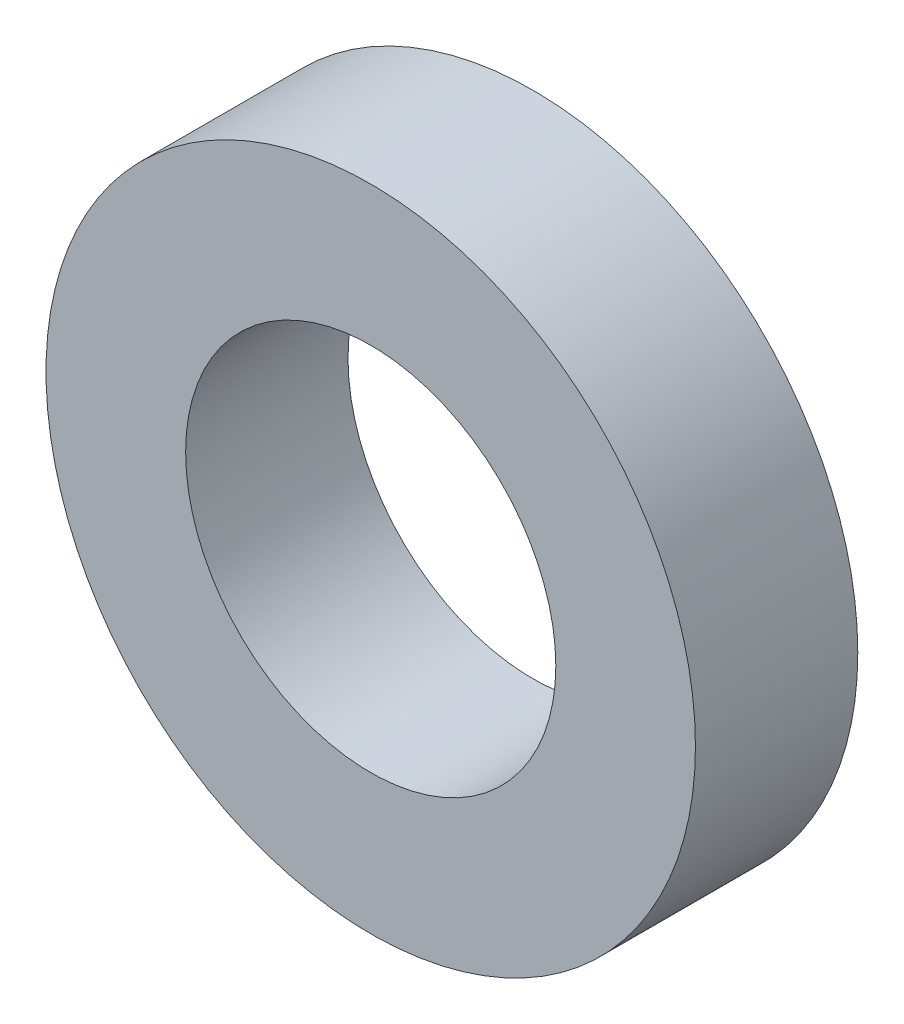
ISO-10303-21;
HEADER;
FILE_DESCRIPTION(('STEP AP214'),'2;1');
FILE_NAME('part.step','',(''),(''),'','','');
FILE_SCHEMA(('AUTOMOTIVE_DESIGN { 1 0 10303 214 1 1 1 1 }'));
ENDSEC;
DATA;
#1=APPLICATION_CONTEXT('core data for automotive mechanical design processes');
#2=APPLICATION_PROTOCOL_DEFINITION('international standard','automotive_design',2000,#1);
#3=PRODUCT_CONTEXT('',#1,'mechanical');
#4=PRODUCT('Part','Part','',(#3));
#5=PRODUCT_RELATED_PRODUCT_CATEGORY('part','',(#4));
#6=PRODUCT_DEFINITION_FORMATION('','',#4);
#7=PRODUCT_DEFINITION_CONTEXT('part definition',#1,'design');
#8=PRODUCT_DEFINITION('design','',#6,#7);
#9=PRODUCT_DEFINITION_SHAPE('','',#8);
#10=(LENGTH_UNIT() NAMED_UNIT(*) SI_UNIT(.MILLI.,.METRE.));
#11=(NAMED_UNIT(*) PLANE_ANGLE_UNIT() SI_UNIT($,.RADIAN.));
#12=(NAMED_UNIT(*) SI_UNIT($,.STERADIAN.) SOLID_ANGLE_UNIT());
#13=UNCERTAINTY_MEASURE_WITH_UNIT(LENGTH_MEASURE(1.E-05),#10,'distance_accuracy_value','');
#14=(GEOMETRIC_REPRESENTATION_CONTEXT(3) GLOBAL_UNCERTAINTY_ASSIGNED_CONTEXT((#13)) GLOBAL_UNIT_ASSIGNED_CONTEXT((#10,
#11,#12)) REPRESENTATION_CONTEXT('',''));
#15=CARTESIAN_POINT('',(0.,0.,0.));
#16=DIRECTION('',(0.,0.,1.));
#17=DIRECTION('',(1.,0.,0.));
#18=AXIS2_PLACEMENT_3D('',#15,#16,#17);
#19=CARTESIAN_POINT('',(0.,0.,14.5));
#20=DIRECTION('',(0.,0.,1.));
#21=DIRECTION('',(1.,0.,0.));
#22=AXIS2_PLACEMENT_3D('',#19,#20,#21);
#23=PLANE('',#22);
#24=CARTESIAN_POINT('',(0.,0.,14.5));
#25=DIRECTION('',(0.,0.,1.));
#26=DIRECTION('',(-1.,0.,0.));
#27=AXIS2_PLACEMENT_3D('',#24,#25,#26);
#28=CIRCLE('',#27,2.85);
#29=CARTESIAN_POINT('',(2.85,0.,14.5));
#30=VERTEX_POINT('',#29);
#31=EDGE_CURVE('E60',#30,#30,#28,.T.);
#32=ORIENTED_EDGE('',*,*,#31,.T.);
#33=EDGE_LOOP('',(#32));
#34=FACE_BOUND('',#33,.T.);
#35=CARTESIAN_POINT('',(0.,0.,14.5));
#36=DIRECTION('',(0.,0.,-1.));
#37=DIRECTION('',(-1.,0.,0.));
#38=AXIS2_PLACEMENT_3D('',#35,#36,#37);
#39=CIRCLE('',#38,5.);
#40=CARTESIAN_POINT('',(5.,0.,14.5));
#41=VERTEX_POINT('',#40);
#42=EDGE_CURVE('E75',#41,#41,#39,.T.);
#43=ORIENTED_EDGE('',*,*,#42,.T.);
#44=EDGE_LOOP('',(#43));
#45=FACE_BOUND('',#44,.T.);
#46=ADVANCED_FACE('F17',(#34,#45),#23,.F.);
#47=CARTESIAN_POINT('',(0.,0.,17.));
#48=DIRECTION('',(0.,0.,1.));
#49=DIRECTION('',(1.,0.,0.));
#50=AXIS2_PLACEMENT_3D('',#47,#48,#49);
#51=PLANE('',#50);
#52=CARTESIAN_POINT('',(0.,0.,17.));
#53=DIRECTION('',(0.,0.,-1.));
#54=DIRECTION('',(-1.,0.,0.));
#55=AXIS2_PLACEMENT_3D('',#52,#53,#54);
#56=CIRCLE('',#55,2.85);
#57=CARTESIAN_POINT('',(2.85,0.,17.));
#58=VERTEX_POINT('',#57);
#59=EDGE_CURVE('E59',#58,#58,#56,.T.);
#60=ORIENTED_EDGE('',*,*,#59,.T.);
#61=EDGE_LOOP('',(#60));
#62=FACE_BOUND('',#61,.T.);
#63=CARTESIAN_POINT('',(0.,0.,17.));
#64=DIRECTION('',(0.,0.,1.));
#65=DIRECTION('',(-1.,0.,0.));
#66=AXIS2_PLACEMENT_3D('',#63,#64,#65);
#67=CIRCLE('',#66,5.);
#68=CARTESIAN_POINT('',(5.,0.,17.));
#69=VERTEX_POINT('',#68);
#70=EDGE_CURVE('E11',#69,#69,#67,.T.);
#71=ORIENTED_EDGE('',*,*,#70,.T.);
#72=EDGE_LOOP('',(#71));
#73=FACE_BOUND('',#72,.T.);
#74=ADVANCED_FACE('F79',(#62,#73),#51,.T.);
#75=CARTESIAN_POINT('',(0.,0.,17.));
#76=DIRECTION('',(0.,0.,-1.));
#77=DIRECTION('',(-1.,0.,0.));
#78=AXIS2_PLACEMENT_3D('',#75,#76,#77);
#79=CYLINDRICAL_SURFACE('',#78,5.);
#80=ORIENTED_EDGE('',*,*,#42,.F.);
#81=DIRECTION('',(0.,0.,1.));
#82=VECTOR('',#81,1.);
#83=CARTESIAN_POINT('',(5.,0.,17.));
#84=LINE('',#83,#82);
#85=EDGE_CURVE('E20',#41,#69,#84,.T.);
#86=ORIENTED_EDGE('',*,*,#85,.T.);
#87=ORIENTED_EDGE('',*,*,#70,.F.);
#88=ORIENTED_EDGE('',*,*,#85,.F.);
#89=EDGE_LOOP('',(#80,#86,#87,#88));
#90=FACE_BOUND('',#89,.T.);
#91=ADVANCED_FACE('F77',(#90),#79,.T.);
#92=CARTESIAN_POINT('',(0.,0.,17.));
#93=DIRECTION('',(0.,0.,-1.));
#94=DIRECTION('',(-1.,0.,0.));
#95=AXIS2_PLACEMENT_3D('',#92,#93,#94);
#96=CYLINDRICAL_SURFACE('',#95,2.85);
#97=ORIENTED_EDGE('',*,*,#31,.F.);
#98=DIRECTION('',(0.,0.,1.));
#99=VECTOR('',#98,1.);
#100=CARTESIAN_POINT('',(2.85,0.,17.));
#101=LINE('',#100,#99);
#102=EDGE_CURVE('E53',#30,#58,#101,.T.);
#103=ORIENTED_EDGE('',*,*,#102,.T.);
#104=ORIENTED_EDGE('',*,*,#59,.F.);
#105=ORIENTED_EDGE('',*,*,#102,.F.);
#106=EDGE_LOOP('',(#97,#103,#104,#105));
#107=FACE_BOUND('',#106,.T.);
#108=ADVANCED_FACE('F57',(#107),#96,.F.);
#109=CLOSED_SHELL('',(#46,#74,#91,#108));
#110=MANIFOLD_SOLID_BREP('B1',#109);
#111=ADVANCED_BREP_SHAPE_REPRESENTATION('',(#18,#110),#14);
#112=SHAPE_DEFINITION_REPRESENTATION(#9,#111);
ENDSEC;
END-ISO-10303-21;
